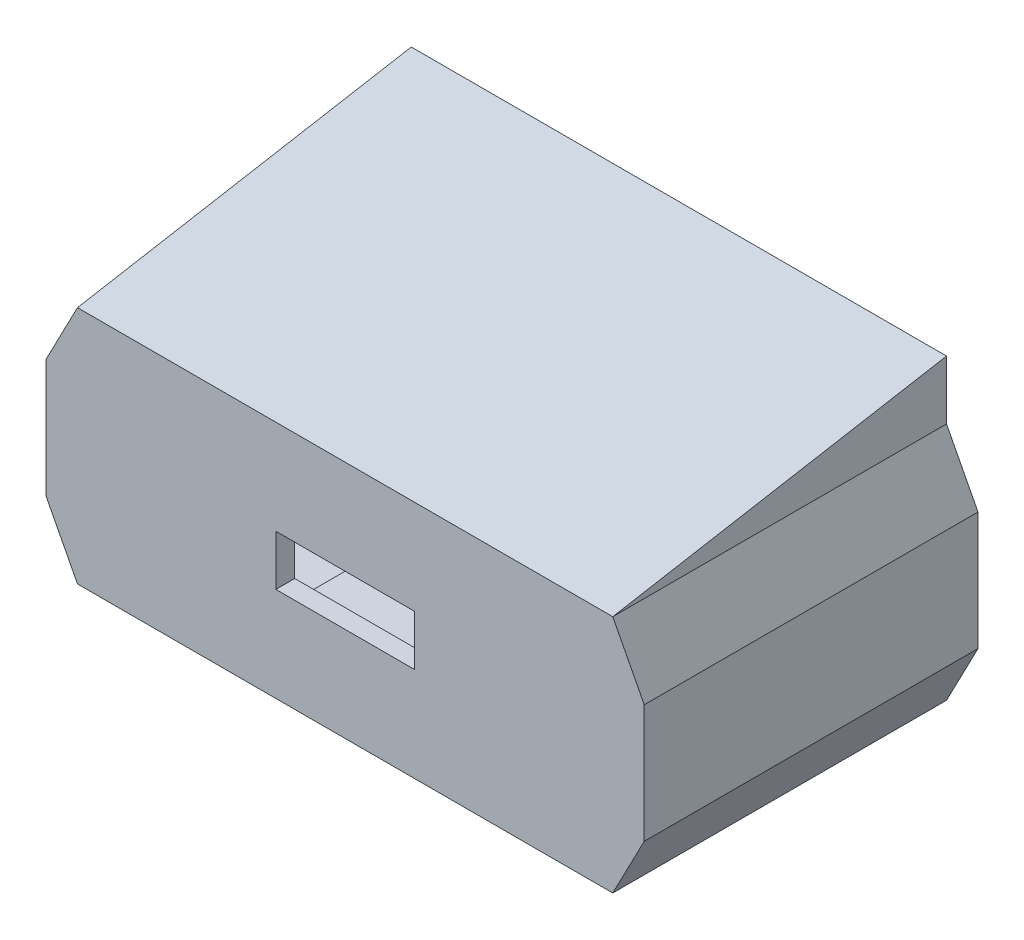
ISO-10303-21;
HEADER;
FILE_DESCRIPTION(('STEP AP214'),'2;1');
FILE_NAME('part.step','',(''),(''),'','','');
FILE_SCHEMA(('AUTOMOTIVE_DESIGN { 1 0 10303 214 1 1 1 1 }'));
ENDSEC;
DATA;
#1=APPLICATION_CONTEXT('core data for automotive mechanical design processes');
#2=APPLICATION_PROTOCOL_DEFINITION('international standard','automotive_design',2000,#1);
#3=PRODUCT_CONTEXT('',#1,'mechanical');
#4=PRODUCT('Part','Part','',(#3));
#5=PRODUCT_RELATED_PRODUCT_CATEGORY('part','',(#4));
#6=PRODUCT_DEFINITION_FORMATION('','',#4);
#7=PRODUCT_DEFINITION_CONTEXT('part definition',#1,'design');
#8=PRODUCT_DEFINITION('design','',#6,#7);
#9=PRODUCT_DEFINITION_SHAPE('','',#8);
#10=(LENGTH_UNIT() NAMED_UNIT(*) SI_UNIT(.MILLI.,.METRE.));
#11=(NAMED_UNIT(*) PLANE_ANGLE_UNIT() SI_UNIT($,.RADIAN.));
#12=(NAMED_UNIT(*) SI_UNIT($,.STERADIAN.) SOLID_ANGLE_UNIT());
#13=UNCERTAINTY_MEASURE_WITH_UNIT(LENGTH_MEASURE(1.E-05),#10,'distance_accuracy_value','');
#14=(GEOMETRIC_REPRESENTATION_CONTEXT(3) GLOBAL_UNCERTAINTY_ASSIGNED_CONTEXT((#13)) GLOBAL_UNIT_ASSIGNED_CONTEXT((#10,
#11,#12)) REPRESENTATION_CONTEXT('',''));
#15=CARTESIAN_POINT('',(0.,0.,0.));
#16=DIRECTION('',(0.,0.,1.));
#17=DIRECTION('',(1.,0.,0.));
#18=AXIS2_PLACEMENT_3D('',#15,#16,#17);
#19=CARTESIAN_POINT('',(0.,3.,0.));
#20=DIRECTION('',(0.,-1.,0.));
#21=DIRECTION('',(0.,0.,-1.));
#22=AXIS2_PLACEMENT_3D('',#19,#20,#21);
#23=PLANE('',#22);
#24=DIRECTION('',(0.,0.,1.));
#25=VECTOR('',#24,1.);
#26=CARTESIAN_POINT('',(50.,3.,-53.));
#27=LINE('',#26,#25);
#28=CARTESIAN_POINT('',(50.,3.,-53.));
#29=VERTEX_POINT('',#28);
#30=CARTESIAN_POINT('',(50.,3.,-47.5));
#31=VERTEX_POINT('',#30);
#32=EDGE_CURVE('E50',#29,#31,#27,.T.);
#33=ORIENTED_EDGE('',*,*,#32,.T.);
#34=DIRECTION('',(-1.,0.,0.));
#35=VECTOR('',#34,1.);
#36=CARTESIAN_POINT('',(50.,3.,-47.5));
#37=LINE('',#36,#35);
#38=CARTESIAN_POINT('',(43.,3.,-47.5));
#39=VERTEX_POINT('',#38);
#40=EDGE_CURVE('E54',#31,#39,#37,.T.);
#41=ORIENTED_EDGE('',*,*,#40,.T.);
#42=DIRECTION('',(0.,0.,1.));
#43=VECTOR('',#42,1.);
#44=CARTESIAN_POINT('',(43.,3.,-53.));
#45=LINE('',#44,#43);
#46=CARTESIAN_POINT('',(43.,3.,-53.));
#47=VERTEX_POINT('',#46);
#48=EDGE_CURVE('E596',#47,#39,#45,.T.);
#49=ORIENTED_EDGE('',*,*,#48,.F.);
#50=DIRECTION('',(-1.,0.,0.));
#51=VECTOR('',#50,1.);
#52=CARTESIAN_POINT('',(0.,3.,-53.));
#53=LINE('',#52,#51);
#54=CARTESIAN_POINT('',(0.,3.,-53.));
#55=VERTEX_POINT('',#54);
#56=EDGE_CURVE('E376',#47,#55,#53,.T.);
#57=ORIENTED_EDGE('',*,*,#56,.T.);
#58=DIRECTION('',(0.,0.,1.));
#59=VECTOR('',#58,1.);
#60=CARTESIAN_POINT('',(0.,3.,0.));
#61=LINE('',#60,#59);
#62=CARTESIAN_POINT('',(0.,3.,-3.));
#63=VERTEX_POINT('',#62);
#64=EDGE_CURVE('E469',#55,#63,#61,.T.);
#65=ORIENTED_EDGE('',*,*,#64,.T.);
#66=DIRECTION('',(1.,0.,0.));
#67=VECTOR('',#66,1.);
#68=CARTESIAN_POINT('',(0.,3.,-3.));
#69=LINE('',#68,#67);
#70=CARTESIAN_POINT('',(85.,3.,-3.));
#71=VERTEX_POINT('',#70);
#72=EDGE_CURVE('E416',#63,#71,#69,.T.);
#73=ORIENTED_EDGE('',*,*,#72,.T.);
#74=DIRECTION('',(0.,0.,-1.));
#75=VECTOR('',#74,1.);
#76=CARTESIAN_POINT('',(85.,3.,0.));
#77=LINE('',#76,#75);
#78=CARTESIAN_POINT('',(85.,3.,-53.));
#79=VERTEX_POINT('',#78);
#80=EDGE_CURVE('E471',#71,#79,#77,.T.);
#81=ORIENTED_EDGE('',*,*,#80,.T.);
#82=EDGE_CURVE('E377',#79,#29,#53,.T.);
#83=ORIENTED_EDGE('',*,*,#82,.T.);
#84=EDGE_LOOP('',(#33,#41,#49,#57,#65,#73,#81,#83));
#85=FACE_BOUND('',#84,.T.);
#86=ADVANCED_FACE('F35',(#85),#23,.F.);
#87=CARTESIAN_POINT('',(61.5,10.,-53.));
#88=DIRECTION('',(0.,1.,0.));
#89=DIRECTION('',(-1.,0.,0.));
#90=AXIS2_PLACEMENT_3D('',#87,#88,#89);
#91=PLANE('',#90);
#92=DIRECTION('',(0.,0.,-1.));
#93=VECTOR('',#92,1.);
#94=CARTESIAN_POINT('',(50.,10.,-47.5));
#95=LINE('',#94,#93);
#96=CARTESIAN_POINT('',(50.,10.,-47.5));
#97=VERTEX_POINT('',#96);
#98=CARTESIAN_POINT('',(50.,10.,-53.));
#99=VERTEX_POINT('',#98);
#100=EDGE_CURVE('E270',#97,#99,#95,.T.);
#101=ORIENTED_EDGE('',*,*,#100,.T.);
#102=DIRECTION('',(-1.,0.,0.));
#103=VECTOR('',#102,1.);
#104=CARTESIAN_POINT('',(61.5,10.,-53.));
#105=LINE('',#104,#103);
#106=CARTESIAN_POINT('',(61.5,10.,-53.));
#107=VERTEX_POINT('',#106);
#108=EDGE_CURVE('E280',#107,#99,#105,.T.);
#109=ORIENTED_EDGE('',*,*,#108,.F.);
#110=DIRECTION('',(0.,0.,1.));
#111=VECTOR('',#110,1.);
#112=CARTESIAN_POINT('',(61.5,10.,-53.));
#113=LINE('',#112,#111);
#114=CARTESIAN_POINT('',(61.5,10.,-3.));
#115=VERTEX_POINT('',#114);
#116=EDGE_CURVE('E321',#107,#115,#113,.T.);
#117=ORIENTED_EDGE('',*,*,#116,.T.);
#118=DIRECTION('',(-1.,0.,0.));
#119=VECTOR('',#118,1.);
#120=CARTESIAN_POINT('',(61.5,10.,-3.));
#121=LINE('',#120,#119);
#122=CARTESIAN_POINT('',(31.5,10.,-3.));
#123=VERTEX_POINT('',#122);
#124=EDGE_CURVE('E303',#115,#123,#121,.T.);
#125=ORIENTED_EDGE('',*,*,#124,.T.);
#126=DIRECTION('',(0.,0.,1.));
#127=VECTOR('',#126,1.);
#128=CARTESIAN_POINT('',(31.5,10.,-53.));
#129=LINE('',#128,#127);
#130=CARTESIAN_POINT('',(31.5,10.,-53.));
#131=VERTEX_POINT('',#130);
#132=EDGE_CURVE('E318',#131,#123,#129,.T.);
#133=ORIENTED_EDGE('',*,*,#132,.F.);
#134=CARTESIAN_POINT('',(43.,10.,-53.));
#135=VERTEX_POINT('',#134);
#136=EDGE_CURVE('E291',#135,#131,#105,.T.);
#137=ORIENTED_EDGE('',*,*,#136,.F.);
#138=DIRECTION('',(0.,0.,-1.));
#139=VECTOR('',#138,1.);
#140=CARTESIAN_POINT('',(43.,10.,-47.5));
#141=LINE('',#140,#139);
#142=CARTESIAN_POINT('',(43.,10.,-47.5));
#143=VERTEX_POINT('',#142);
#144=EDGE_CURVE('E603',#143,#135,#141,.T.);
#145=ORIENTED_EDGE('',*,*,#144,.F.);
#146=DIRECTION('',(-1.,0.,0.));
#147=VECTOR('',#146,1.);
#148=CARTESIAN_POINT('',(50.,10.,-47.5));
#149=LINE('',#148,#147);
#150=EDGE_CURVE('E283',#97,#143,#149,.T.);
#151=ORIENTED_EDGE('',*,*,#150,.F.);
#152=EDGE_LOOP('',(#101,#109,#117,#125,#133,#137,#145,#151));
#153=FACE_BOUND('',#152,.T.);
#154=ADVANCED_FACE('F278',(#153),#91,.F.);
#155=CARTESIAN_POINT('',(0.,23.,-93.));
#156=DIRECTION('',(0.,-1.,0.));
#157=DIRECTION('',(0.,0.,-1.));
#158=AXIS2_PLACEMENT_3D('',#155,#156,#157);
#159=PLANE('',#158);
#160=DIRECTION('',(0.,0.,1.));
#161=VECTOR('',#160,1.);
#162=CARTESIAN_POINT('',(-3.1,23.,-93.));
#163=LINE('',#162,#161);
#164=CARTESIAN_POINT('',(-3.1,23.,-53.));
#165=VERTEX_POINT('',#164);
#166=CARTESIAN_POINT('',(-3.1,23.,-3.));
#167=VERTEX_POINT('',#166);
#168=EDGE_CURVE('E422',#165,#167,#163,.T.);
#169=ORIENTED_EDGE('',*,*,#168,.T.);
#170=DIRECTION('',(1.,0.,0.));
#171=VECTOR('',#170,1.);
#172=CARTESIAN_POINT('',(0.,23.,-3.));
#173=LINE('',#172,#171);
#174=CARTESIAN_POINT('',(0.,23.,-3.));
#175=VERTEX_POINT('',#174);
#176=EDGE_CURVE('E533',#167,#175,#173,.T.);
#177=ORIENTED_EDGE('',*,*,#176,.T.);
#178=DIRECTION('',(0.,0.,1.));
#179=VECTOR('',#178,1.);
#180=CARTESIAN_POINT('',(0.,23.,-93.));
#181=LINE('',#180,#179);
#182=CARTESIAN_POINT('',(0.,23.,-53.));
#183=VERTEX_POINT('',#182);
#184=EDGE_CURVE('E429',#183,#175,#181,.T.);
#185=ORIENTED_EDGE('',*,*,#184,.F.);
#186=DIRECTION('',(-1.,0.,0.));
#187=VECTOR('',#186,1.);
#188=CARTESIAN_POINT('',(0.,23.,-53.));
#189=LINE('',#188,#187);
#190=EDGE_CURVE('E364',#183,#165,#189,.T.);
#191=ORIENTED_EDGE('',*,*,#190,.T.);
#192=EDGE_LOOP('',(#169,#177,#185,#191));
#193=FACE_BOUND('',#192,.T.);
#194=ADVANCED_FACE('F586',(#193),#159,.F.);
#195=CARTESIAN_POINT('',(85.,38.,-3.00000000000004));
#196=DIRECTION('',(0.,0.,1.));
#197=DIRECTION('',(1.,0.,0.));
#198=AXIS2_PLACEMENT_3D('',#195,#196,#197);
#199=PLANE('',#198);
#200=DIRECTION('',(0.,-1.,0.));
#201=VECTOR('',#200,1.);
#202=CARTESIAN_POINT('',(0.,23.,-3.));
#203=LINE('',#202,#201);
#204=EDGE_CURVE('E411',#175,#63,#203,.T.);
#205=ORIENTED_EDGE('',*,*,#204,.F.);
#206=ORIENTED_EDGE('',*,*,#176,.F.);
#207=DIRECTION('',(-0.707106781186548,-0.707106781186547,0.));
#208=VECTOR('',#207,1.);
#209=CARTESIAN_POINT('',(-3.1,23.,-3.));
#210=LINE('',#209,#208);
#211=CARTESIAN_POINT('',(0.,26.1,-3.));
#212=VERTEX_POINT('',#211);
#213=EDGE_CURVE('E529',#212,#167,#210,.T.);
#214=ORIENTED_EDGE('',*,*,#213,.F.);
#215=DIRECTION('',(0.,1.,0.));
#216=VECTOR('',#215,1.);
#217=CARTESIAN_POINT('',(0.,38.,-3.));
#218=LINE('',#217,#216);
#219=CARTESIAN_POINT('',(0.,28.,-3.00000000000003));
#220=VERTEX_POINT('',#219);
#221=EDGE_CURVE('E518',#212,#220,#218,.T.);
#222=ORIENTED_EDGE('',*,*,#221,.T.);
#223=DIRECTION('',(-0.707106781186549,-0.707106781186546,0.));
#224=VECTOR('',#223,1.);
#225=CARTESIAN_POINT('',(47.5000000000002,75.5,-3.00000000000004));
#226=LINE('',#225,#224);
#227=CARTESIAN_POINT('',(3.,31.,-3.00000000000006));
#228=VERTEX_POINT('',#227);
#229=EDGE_CURVE('E485',#220,#228,#226,.F.);
#230=ORIENTED_EDGE('',*,*,#229,.T.);
#231=DIRECTION('',(0.,-1.,0.));
#232=VECTOR('',#231,1.);
#233=CARTESIAN_POINT('',(3.,38.,-3.00000000000006));
#234=LINE('',#233,#232);
#235=CARTESIAN_POINT('',(3.,35.482701106467,-3.00000000000006));
#236=VERTEX_POINT('',#235);
#237=EDGE_CURVE('E406',#236,#228,#234,.T.);
#238=ORIENTED_EDGE('',*,*,#237,.F.);
#239=DIRECTION('',(1.,0.,0.));
#240=VECTOR('',#239,1.);
#241=CARTESIAN_POINT('',(85.,35.482701106467,-3.00000000000004));
#242=LINE('',#241,#240);
#243=CARTESIAN_POINT('',(82.,35.482701106467,-3.00000000000008));
#244=VERTEX_POINT('',#243);
#245=EDGE_CURVE('E399',#236,#244,#242,.T.);
#246=ORIENTED_EDGE('',*,*,#245,.T.);
#247=DIRECTION('',(0.,-1.,0.));
#248=VECTOR('',#247,1.);
#249=CARTESIAN_POINT('',(82.,38.,-3.00000000000008));
#250=LINE('',#249,#248);
#251=CARTESIAN_POINT('',(82.,31.,-3.00000000000008));
#252=VERTEX_POINT('',#251);
#253=EDGE_CURVE('E403',#244,#252,#250,.T.);
#254=ORIENTED_EDGE('',*,*,#253,.T.);
#255=DIRECTION('',(-0.707106781186549,0.707106781186546,0.));
#256=VECTOR('',#255,1.);
#257=CARTESIAN_POINT('',(80.,33.,-3.00000000000004));
#258=LINE('',#257,#256);
#259=CARTESIAN_POINT('',(85.,28.,-3.00000000000004));
#260=VERTEX_POINT('',#259);
#261=EDGE_CURVE('E488',#252,#260,#258,.F.);
#262=ORIENTED_EDGE('',*,*,#261,.T.);
#263=DIRECTION('',(0.,-1.,0.));
#264=VECTOR('',#263,1.);
#265=CARTESIAN_POINT('',(85.,38.,-3.));
#266=LINE('',#265,#264);
#267=CARTESIAN_POINT('',(85.,26.1,-3.));
#268=VERTEX_POINT('',#267);
#269=EDGE_CURVE('E522',#260,#268,#266,.T.);
#270=ORIENTED_EDGE('',*,*,#269,.T.);
#271=DIRECTION('',(-0.707106781186547,0.707106781186548,0.));
#272=VECTOR('',#271,1.);
#273=CARTESIAN_POINT('',(88.1,23.,-3.));
#274=LINE('',#273,#272);
#275=CARTESIAN_POINT('',(88.1,23.,-3.));
#276=VERTEX_POINT('',#275);
#277=EDGE_CURVE('E531',#276,#268,#274,.T.);
#278=ORIENTED_EDGE('',*,*,#277,.F.);
#279=DIRECTION('',(1.,0.,0.));
#280=VECTOR('',#279,1.);
#281=CARTESIAN_POINT('',(0.,23.,-3.));
#282=LINE('',#281,#280);
#283=CARTESIAN_POINT('',(85.,23.,-3.));
#284=VERTEX_POINT('',#283);
#285=EDGE_CURVE('E304',#284,#276,#282,.T.);
#286=ORIENTED_EDGE('',*,*,#285,.F.);
#287=DIRECTION('',(0.,1.,0.));
#288=VECTOR('',#287,1.);
#289=CARTESIAN_POINT('',(85.,23.,-3.));
#290=LINE('',#289,#288);
#291=EDGE_CURVE('E418',#71,#284,#290,.T.);
#292=ORIENTED_EDGE('',*,*,#291,.F.);
#293=ORIENTED_EDGE('',*,*,#72,.F.);
#294=EDGE_LOOP('',(#205,#206,#214,#222,#230,#238,#246,#254,#262,#270,#278,#286,#292,#293));
#295=FACE_BOUND('',#294,.T.);
#296=DIRECTION('',(1.,0.,0.));
#297=VECTOR('',#296,1.);
#298=CARTESIAN_POINT('',(0.,23.,-3.));
#299=LINE('',#298,#297);
#300=CARTESIAN_POINT('',(31.5,23.,-3.));
#301=VERTEX_POINT('',#300);
#302=CARTESIAN_POINT('',(53.5,23.,-3.));
#303=VERTEX_POINT('',#302);
#304=EDGE_CURVE('E511',#301,#303,#299,.T.);
#305=ORIENTED_EDGE('',*,*,#304,.F.);
#306=DIRECTION('',(0.,-1.,0.));
#307=VECTOR('',#306,1.);
#308=CARTESIAN_POINT('',(31.5,0.,-3.));
#309=LINE('',#308,#307);
#310=CARTESIAN_POINT('',(31.5,15.,-3.));
#311=VERTEX_POINT('',#310);
#312=EDGE_CURVE('E11',#301,#311,#309,.T.);
#313=ORIENTED_EDGE('',*,*,#312,.T.);
#314=DIRECTION('',(1.,0.,0.));
#315=VECTOR('',#314,1.);
#316=CARTESIAN_POINT('',(0.,15.,-3.));
#317=LINE('',#316,#315);
#318=CARTESIAN_POINT('',(53.5,15.,-3.));
#319=VERTEX_POINT('',#318);
#320=EDGE_CURVE('E502',#311,#319,#317,.T.);
#321=ORIENTED_EDGE('',*,*,#320,.T.);
#322=DIRECTION('',(0.,1.,0.));
#323=VECTOR('',#322,1.);
#324=CARTESIAN_POINT('',(53.5,0.,-3.));
#325=LINE('',#324,#323);
#326=EDGE_CURVE('E43',#319,#303,#325,.T.);
#327=ORIENTED_EDGE('',*,*,#326,.T.);
#328=EDGE_LOOP('',(#305,#313,#321,#327));
#329=FACE_BOUND('',#328,.T.);
#330=DIRECTION('',(0.,-1.,0.));
#331=VECTOR('',#330,1.);
#332=CARTESIAN_POINT('',(61.5,12.,-3.));
#333=LINE('',#332,#331);
#334=CARTESIAN_POINT('',(61.5,12.,-3.));
#335=VERTEX_POINT('',#334);
#336=EDGE_CURVE('E300',#335,#115,#333,.T.);
#337=ORIENTED_EDGE('',*,*,#336,.F.);
#338=DIRECTION('',(1.,0.,0.));
#339=VECTOR('',#338,1.);
#340=CARTESIAN_POINT('',(61.5,12.,-3.));
#341=LINE('',#340,#339);
#342=CARTESIAN_POINT('',(31.5,12.,-3.));
#343=VERTEX_POINT('',#342);
#344=EDGE_CURVE('E310',#343,#335,#341,.T.);
#345=ORIENTED_EDGE('',*,*,#344,.F.);
#346=DIRECTION('',(0.,1.,0.));
#347=VECTOR('',#346,1.);
#348=CARTESIAN_POINT('',(31.5,12.,-3.));
#349=LINE('',#348,#347);
#350=EDGE_CURVE('E307',#123,#343,#349,.T.);
#351=ORIENTED_EDGE('',*,*,#350,.F.);
#352=ORIENTED_EDGE('',*,*,#124,.F.);
#353=EDGE_LOOP('',(#337,#345,#351,#352));
#354=FACE_BOUND('',#353,.T.);
#355=ADVANCED_FACE('F509',(#295,#329,#354),#199,.F.);
#356=CARTESIAN_POINT('',(85.,38.,-93.));
#357=DIRECTION('',(-1.,0.,0.));
#358=DIRECTION('',(0.,0.,1.));
#359=AXIS2_PLACEMENT_3D('',#356,#357,#358);
#360=PLANE('',#359);
#361=ORIENTED_EDGE('',*,*,#269,.F.);
#362=DIRECTION('',(0.,0.,1.));
#363=VECTOR('',#362,1.);
#364=CARTESIAN_POINT('',(85.,28.,-10.));
#365=LINE('',#364,#363);
#366=CARTESIAN_POINT('',(85.,28.,-53.));
#367=VERTEX_POINT('',#366);
#368=EDGE_CURVE('E408',#367,#260,#365,.T.);
#369=ORIENTED_EDGE('',*,*,#368,.F.);
#370=DIRECTION('',(0.,1.,0.));
#371=VECTOR('',#370,1.);
#372=CARTESIAN_POINT('',(85.,38.,-53.));
#373=LINE('',#372,#371);
#374=CARTESIAN_POINT('',(85.,26.1,-53.));
#375=VERTEX_POINT('',#374);
#376=EDGE_CURVE('E359',#375,#367,#373,.T.);
#377=ORIENTED_EDGE('',*,*,#376,.F.);
#378=DIRECTION('',(0.,0.,1.));
#379=VECTOR('',#378,1.);
#380=CARTESIAN_POINT('',(85.,26.1,-93.));
#381=LINE('',#380,#379);
#382=EDGE_CURVE('E432',#375,#268,#381,.T.);
#383=ORIENTED_EDGE('',*,*,#382,.T.);
#384=EDGE_LOOP('',(#361,#369,#377,#383));
#385=FACE_BOUND('',#384,.T.);
#386=ADVANCED_FACE('F550',(#385),#360,.T.);
#387=CARTESIAN_POINT('',(0.,38.,-93.));
#388=DIRECTION('',(1.,0.,0.));
#389=DIRECTION('',(0.,1.,0.));
#390=AXIS2_PLACEMENT_3D('',#387,#388,#389);
#391=PLANE('',#390);
#392=ORIENTED_EDGE('',*,*,#221,.F.);
#393=DIRECTION('',(0.,0.,1.));
#394=VECTOR('',#393,1.);
#395=CARTESIAN_POINT('',(0.,26.1,-93.));
#396=LINE('',#395,#394);
#397=CARTESIAN_POINT('',(0.,26.1,-53.));
#398=VERTEX_POINT('',#397);
#399=EDGE_CURVE('E426',#398,#212,#396,.T.);
#400=ORIENTED_EDGE('',*,*,#399,.F.);
#401=DIRECTION('',(0.,-1.,0.));
#402=VECTOR('',#401,1.);
#403=CARTESIAN_POINT('',(0.,38.,-53.));
#404=LINE('',#403,#402);
#405=CARTESIAN_POINT('',(0.,28.,-53.));
#406=VERTEX_POINT('',#405);
#407=EDGE_CURVE('E357',#406,#398,#404,.T.);
#408=ORIENTED_EDGE('',*,*,#407,.F.);
#409=DIRECTION('',(0.,0.,1.));
#410=VECTOR('',#409,1.);
#411=CARTESIAN_POINT('',(0.,28.,-10.));
#412=LINE('',#411,#410);
#413=EDGE_CURVE('E409',#406,#220,#412,.T.);
#414=ORIENTED_EDGE('',*,*,#413,.T.);
#415=EDGE_LOOP('',(#392,#400,#408,#414));
#416=FACE_BOUND('',#415,.T.);
#417=ADVANCED_FACE('F577',(#416),#391,.T.);
#418=DIRECTION('',(0.,-1.,0.));
#419=VECTOR('',#418,1.);
#420=CARTESIAN_POINT('',(0.,38.,-53.));
#421=LINE('',#420,#419);
#422=EDGE_CURVE('E371',#183,#55,#421,.T.);
#423=ORIENTED_EDGE('',*,*,#422,.F.);
#424=ORIENTED_EDGE('',*,*,#184,.T.);
#425=ORIENTED_EDGE('',*,*,#204,.T.);
#426=ORIENTED_EDGE('',*,*,#64,.F.);
#427=EDGE_LOOP('',(#423,#424,#425,#426));
#428=FACE_BOUND('',#427,.T.);
#429=ADVANCED_FACE('F589',(#428),#391,.T.);
#430=DIRECTION('',(0.,1.,0.));
#431=VECTOR('',#430,1.);
#432=CARTESIAN_POINT('',(85.,38.,-53.));
#433=LINE('',#432,#431);
#434=CARTESIAN_POINT('',(85.,23.,-53.));
#435=VERTEX_POINT('',#434);
#436=EDGE_CURVE('E374',#79,#435,#433,.T.);
#437=ORIENTED_EDGE('',*,*,#436,.F.);
#438=ORIENTED_EDGE('',*,*,#80,.F.);
#439=ORIENTED_EDGE('',*,*,#291,.T.);
#440=DIRECTION('',(0.,0.,1.));
#441=VECTOR('',#440,1.);
#442=CARTESIAN_POINT('',(85.,23.,-93.));
#443=LINE('',#442,#441);
#444=EDGE_CURVE('E421',#435,#284,#443,.T.);
#445=ORIENTED_EDGE('',*,*,#444,.F.);
#446=EDGE_LOOP('',(#437,#438,#439,#445));
#447=FACE_BOUND('',#446,.T.);
#448=ADVANCED_FACE('F649',(#447),#360,.T.);
#449=CARTESIAN_POINT('',(0.,3.,0.));
#450=DIRECTION('',(0.,0.,-1.));
#451=DIRECTION('',(-1.,0.,0.));
#452=AXIS2_PLACEMENT_3D('',#449,#450,#451);
#453=PLANE('',#452);
#454=DIRECTION('',(-1.,0.,0.));
#455=VECTOR('',#454,1.);
#456=CARTESIAN_POINT('',(31.5,23.,0.));
#457=LINE('',#456,#455);
#458=CARTESIAN_POINT('',(53.5,23.,0.));
#459=VERTEX_POINT('',#458);
#460=CARTESIAN_POINT('',(31.5,23.,0.));
#461=VERTEX_POINT('',#460);
#462=EDGE_CURVE('E519',#459,#461,#457,.T.);
#463=ORIENTED_EDGE('',*,*,#462,.F.);
#464=DIRECTION('',(0.,1.,0.));
#465=VECTOR('',#464,1.);
#466=CARTESIAN_POINT('',(53.5,23.,0.));
#467=LINE('',#466,#465);
#468=CARTESIAN_POINT('',(53.5,15.,0.));
#469=VERTEX_POINT('',#468);
#470=EDGE_CURVE('E329',#469,#459,#467,.T.);
#471=ORIENTED_EDGE('',*,*,#470,.F.);
#472=DIRECTION('',(1.,0.,0.));
#473=VECTOR('',#472,1.);
#474=CARTESIAN_POINT('',(31.5,15.,0.));
#475=LINE('',#474,#473);
#476=CARTESIAN_POINT('',(31.5,15.,0.));
#477=VERTEX_POINT('',#476);
#478=EDGE_CURVE('E326',#477,#469,#475,.T.);
#479=ORIENTED_EDGE('',*,*,#478,.F.);
#480=DIRECTION('',(0.,-1.,0.));
#481=VECTOR('',#480,1.);
#482=CARTESIAN_POINT('',(31.5,23.,0.));
#483=LINE('',#482,#481);
#484=EDGE_CURVE('E323',#461,#477,#483,.T.);
#485=ORIENTED_EDGE('',*,*,#484,.F.);
#486=EDGE_LOOP('',(#463,#471,#479,#485));
#487=FACE_BOUND('',#486,.T.);
#488=DIRECTION('',(-0.461591586339288,0.887092558542106,0.));
#489=VECTOR('',#488,1.);
#490=CARTESIAN_POINT('',(90.,28.3909366548759,0.));
#491=LINE('',#490,#489);
#492=CARTESIAN_POINT('',(90.,28.3909366548759,0.));
#493=VERTEX_POINT('',#492);
#494=CARTESIAN_POINT('',(85.,38.,0.));
#495=VERTEX_POINT('',#494);
#496=EDGE_CURVE('E444',#493,#495,#491,.T.);
#497=ORIENTED_EDGE('',*,*,#496,.T.);
#498=DIRECTION('',(-1.,0.,0.));
#499=VECTOR('',#498,1.);
#500=CARTESIAN_POINT('',(0.,37.9999999999988,0.));
#501=LINE('',#500,#499);
#502=CARTESIAN_POINT('',(0.,38.,0.));
#503=VERTEX_POINT('',#502);
#504=EDGE_CURVE('E494',#495,#503,#501,.T.);
#505=ORIENTED_EDGE('',*,*,#504,.T.);
#506=DIRECTION('',(-0.461591586339287,-0.887092558542106,0.));
#507=VECTOR('',#506,1.);
#508=CARTESIAN_POINT('',(-5.,28.3909366548759,0.));
#509=LINE('',#508,#507);
#510=CARTESIAN_POINT('',(-5.,28.3909366548759,0.));
#511=VERTEX_POINT('',#510);
#512=EDGE_CURVE('E456',#503,#511,#509,.T.);
#513=ORIENTED_EDGE('',*,*,#512,.T.);
#514=DIRECTION('',(0.,-1.,0.));
#515=VECTOR('',#514,1.);
#516=CARTESIAN_POINT('',(-5.,9.60906334512409,0.));
#517=LINE('',#516,#515);
#518=CARTESIAN_POINT('',(-5.,9.60906334512409,0.));
#519=VERTEX_POINT('',#518);
#520=EDGE_CURVE('E459',#511,#519,#517,.T.);
#521=ORIENTED_EDGE('',*,*,#520,.T.);
#522=DIRECTION('',(0.461591586339287,-0.887092558542106,0.));
#523=VECTOR('',#522,1.);
#524=CARTESIAN_POINT('',(0.,0.,0.));
#525=LINE('',#524,#523);
#526=CARTESIAN_POINT('',(0.,0.,0.));
#527=VERTEX_POINT('',#526);
#528=EDGE_CURVE('E450',#519,#527,#525,.T.);
#529=ORIENTED_EDGE('',*,*,#528,.T.);
#530=DIRECTION('',(1.,0.,0.));
#531=VECTOR('',#530,1.);
#532=CARTESIAN_POINT('',(0.,0.,0.));
#533=LINE('',#532,#531);
#534=CARTESIAN_POINT('',(85.,0.,0.));
#535=VERTEX_POINT('',#534);
#536=EDGE_CURVE('E477',#527,#535,#533,.T.);
#537=ORIENTED_EDGE('',*,*,#536,.T.);
#538=DIRECTION('',(0.461591586339288,0.887092558542106,0.));
#539=VECTOR('',#538,1.);
#540=CARTESIAN_POINT('',(85.,0.,0.));
#541=LINE('',#540,#539);
#542=CARTESIAN_POINT('',(90.,9.60906334512409,0.));
#543=VERTEX_POINT('',#542);
#544=EDGE_CURVE('E425',#535,#543,#541,.T.);
#545=ORIENTED_EDGE('',*,*,#544,.T.);
#546=DIRECTION('',(0.,1.,0.));
#547=VECTOR('',#546,1.);
#548=CARTESIAN_POINT('',(90.,9.60906334512409,0.));
#549=LINE('',#548,#547);
#550=EDGE_CURVE('E441',#543,#493,#549,.T.);
#551=ORIENTED_EDGE('',*,*,#550,.T.);
#552=EDGE_LOOP('',(#497,#505,#513,#521,#529,#537,#545,#551));
#553=FACE_BOUND('',#552,.T.);
#554=ADVANCED_FACE('F645',(#487,#553),#453,.F.);
#555=CARTESIAN_POINT('',(0.,0.,0.));
#556=DIRECTION('',(0.,-1.,0.));
#557=DIRECTION('',(0.,0.,-1.));
#558=AXIS2_PLACEMENT_3D('',#555,#556,#557);
#559=PLANE('',#558);
#560=DIRECTION('',(-1.,0.,0.));
#561=VECTOR('',#560,1.);
#562=CARTESIAN_POINT('',(-5.,0.,-53.));
#563=LINE('',#562,#561);
#564=CARTESIAN_POINT('',(85.,0.,-53.));
#565=VERTEX_POINT('',#564);
#566=CARTESIAN_POINT('',(0.,0.,-53.));
#567=VERTEX_POINT('',#566);
#568=EDGE_CURVE('E334',#565,#567,#563,.T.);
#569=ORIENTED_EDGE('',*,*,#568,.F.);
#570=DIRECTION('',(0.,0.,-1.));
#571=VECTOR('',#570,1.);
#572=CARTESIAN_POINT('',(85.,0.,0.));
#573=LINE('',#572,#571);
#574=EDGE_CURVE('E472',#535,#565,#573,.T.);
#575=ORIENTED_EDGE('',*,*,#574,.F.);
#576=ORIENTED_EDGE('',*,*,#536,.F.);
#577=DIRECTION('',(0.,0.,1.));
#578=VECTOR('',#577,1.);
#579=CARTESIAN_POINT('',(0.,0.,0.));
#580=LINE('',#579,#578);
#581=EDGE_CURVE('E465',#567,#527,#580,.T.);
#582=ORIENTED_EDGE('',*,*,#581,.F.);
#583=EDGE_LOOP('',(#569,#575,#576,#582));
#584=FACE_BOUND('',#583,.T.);
#585=ADVANCED_FACE('F642',(#584),#559,.T.);
#586=CARTESIAN_POINT('',(0.,0.,-93.));
#587=DIRECTION('',(-0.887092558542106,-0.461591586339287,0.));
#588=DIRECTION('',(0.461591586339287,-0.887092558542106,0.));
#589=AXIS2_PLACEMENT_3D('',#586,#587,#588);
#590=PLANE('',#589);
#591=ORIENTED_EDGE('',*,*,#581,.T.);
#592=ORIENTED_EDGE('',*,*,#528,.F.);
#593=DIRECTION('',(0.,0.,1.));
#594=VECTOR('',#593,1.);
#595=CARTESIAN_POINT('',(-5.,9.60906334512409,-93.));
#596=LINE('',#595,#594);
#597=CARTESIAN_POINT('',(-5.,9.6090633451241,-53.));
#598=VERTEX_POINT('',#597);
#599=EDGE_CURVE('E463',#598,#519,#596,.T.);
#600=ORIENTED_EDGE('',*,*,#599,.F.);
#601=DIRECTION('',(-0.461591586339287,0.887092558542106,0.));
#602=VECTOR('',#601,1.);
#603=CARTESIAN_POINT('',(0.,0.,-53.));
#604=LINE('',#603,#602);
#605=EDGE_CURVE('E394',#567,#598,#604,.T.);
#606=ORIENTED_EDGE('',*,*,#605,.F.);
#607=EDGE_LOOP('',(#591,#592,#600,#606));
#608=FACE_BOUND('',#607,.T.);
#609=ADVANCED_FACE('F640',(#608),#590,.T.);
#610=CARTESIAN_POINT('',(-5.,9.60906334512409,-93.));
#611=DIRECTION('',(-1.,0.,0.));
#612=DIRECTION('',(0.,-1.,0.));
#613=AXIS2_PLACEMENT_3D('',#610,#611,#612);
#614=PLANE('',#613);
#615=ORIENTED_EDGE('',*,*,#599,.T.);
#616=ORIENTED_EDGE('',*,*,#520,.F.);
#617=DIRECTION('',(0.,0.,1.));
#618=VECTOR('',#617,1.);
#619=CARTESIAN_POINT('',(-5.,28.3909366548759,-93.));
#620=LINE('',#619,#618);
#621=CARTESIAN_POINT('',(-4.99999999999999,28.3909366548759,-53.));
#622=VERTEX_POINT('',#621);
#623=EDGE_CURVE('E466',#622,#511,#620,.T.);
#624=ORIENTED_EDGE('',*,*,#623,.F.);
#625=DIRECTION('',(0.,-1.,0.));
#626=VECTOR('',#625,1.);
#627=CARTESIAN_POINT('',(-5.,54.3984092058858,-53.));
#628=LINE('',#627,#626);
#629=EDGE_CURVE('E343',#622,#598,#628,.T.);
#630=ORIENTED_EDGE('',*,*,#629,.T.);
#631=EDGE_LOOP('',(#615,#616,#624,#630));
#632=FACE_BOUND('',#631,.T.);
#633=ADVANCED_FACE('F695',(#632),#614,.T.);
#634=CARTESIAN_POINT('',(-5.,28.3909366548759,-93.));
#635=DIRECTION('',(-0.887092558542106,0.461591586339287,0.));
#636=DIRECTION('',(-0.461591586339287,-0.887092558542106,0.));
#637=AXIS2_PLACEMENT_3D('',#634,#635,#636);
#638=PLANE('',#637);
#639=ORIENTED_EDGE('',*,*,#623,.T.);
#640=ORIENTED_EDGE('',*,*,#512,.F.);
#641=DIRECTION('',(0.,0.,1.));
#642=VECTOR('',#641,1.);
#643=CARTESIAN_POINT('',(0.,38.,-93.));
#644=LINE('',#643,#642);
#645=CARTESIAN_POINT('',(0.,38.,-53.));
#646=VERTEX_POINT('',#645);
#647=EDGE_CURVE('E462',#646,#503,#644,.T.);
#648=ORIENTED_EDGE('',*,*,#647,.F.);
#649=DIRECTION('',(0.461591586339287,0.887092558542106,0.));
#650=VECTOR('',#649,1.);
#651=CARTESIAN_POINT('',(-5.,28.3909366548759,-53.));
#652=LINE('',#651,#650);
#653=EDGE_CURVE('E389',#622,#646,#652,.T.);
#654=ORIENTED_EDGE('',*,*,#653,.F.);
#655=EDGE_LOOP('',(#639,#640,#648,#654));
#656=FACE_BOUND('',#655,.T.);
#657=ADVANCED_FACE('F693',(#656),#638,.T.);
#658=CARTESIAN_POINT('',(85.,0.,-93.));
#659=DIRECTION('',(0.887092558542106,-0.461591586339288,0.));
#660=DIRECTION('',(0.461591586339288,0.887092558542106,0.));
#661=AXIS2_PLACEMENT_3D('',#658,#659,#660);
#662=PLANE('',#661);
#663=DIRECTION('',(0.,0.,1.));
#664=VECTOR('',#663,1.);
#665=CARTESIAN_POINT('',(90.,9.60906334512409,-93.));
#666=LINE('',#665,#664);
#667=CARTESIAN_POINT('',(90.,9.6090633451241,-53.));
#668=VERTEX_POINT('',#667);
#669=EDGE_CURVE('E447',#668,#543,#666,.T.);
#670=ORIENTED_EDGE('',*,*,#669,.T.);
#671=ORIENTED_EDGE('',*,*,#544,.F.);
#672=ORIENTED_EDGE('',*,*,#574,.T.);
#673=DIRECTION('',(-0.461591586339288,-0.887092558542106,0.));
#674=VECTOR('',#673,1.);
#675=CARTESIAN_POINT('',(85.,0.,-53.));
#676=LINE('',#675,#674);
#677=EDGE_CURVE('E391',#668,#565,#676,.T.);
#678=ORIENTED_EDGE('',*,*,#677,.F.);
#679=EDGE_LOOP('',(#670,#671,#672,#678));
#680=FACE_BOUND('',#679,.T.);
#681=ADVANCED_FACE('F686',(#680),#662,.T.);
#682=CARTESIAN_POINT('',(90.,28.3909366548759,-93.));
#683=DIRECTION('',(0.887092558542106,0.461591586339288,0.));
#684=DIRECTION('',(-0.461591586339288,0.887092558542106,0.));
#685=AXIS2_PLACEMENT_3D('',#682,#683,#684);
#686=PLANE('',#685);
#687=DIRECTION('',(0.,0.,1.));
#688=VECTOR('',#687,1.);
#689=CARTESIAN_POINT('',(85.,38.,-93.));
#690=LINE('',#689,#688);
#691=CARTESIAN_POINT('',(85.,38.,-53.));
#692=VERTEX_POINT('',#691);
#693=EDGE_CURVE('E448',#692,#495,#690,.T.);
#694=ORIENTED_EDGE('',*,*,#693,.T.);
#695=ORIENTED_EDGE('',*,*,#496,.F.);
#696=DIRECTION('',(0.,0.,1.));
#697=VECTOR('',#696,1.);
#698=CARTESIAN_POINT('',(90.,28.3909366548759,-93.));
#699=LINE('',#698,#697);
#700=CARTESIAN_POINT('',(90.,28.3909366548759,-53.));
#701=VERTEX_POINT('',#700);
#702=EDGE_CURVE('E451',#701,#493,#699,.T.);
#703=ORIENTED_EDGE('',*,*,#702,.F.);
#704=DIRECTION('',(0.461591586339288,-0.887092558542106,0.));
#705=VECTOR('',#704,1.);
#706=CARTESIAN_POINT('',(90.,28.3909366548759,-53.));
#707=LINE('',#706,#705);
#708=EDGE_CURVE('E387',#692,#701,#707,.T.);
#709=ORIENTED_EDGE('',*,*,#708,.F.);
#710=EDGE_LOOP('',(#694,#695,#703,#709));
#711=FACE_BOUND('',#710,.T.);
#712=ADVANCED_FACE('F683',(#711),#686,.T.);
#713=CARTESIAN_POINT('',(90.,9.60906334512409,-93.));
#714=DIRECTION('',(1.,0.,0.));
#715=DIRECTION('',(0.,0.,-1.));
#716=AXIS2_PLACEMENT_3D('',#713,#714,#715);
#717=PLANE('',#716);
#718=ORIENTED_EDGE('',*,*,#702,.T.);
#719=ORIENTED_EDGE('',*,*,#550,.F.);
#720=ORIENTED_EDGE('',*,*,#669,.F.);
#721=DIRECTION('',(0.,-1.,0.));
#722=VECTOR('',#721,1.);
#723=CARTESIAN_POINT('',(90.,54.3984092058858,-53.));
#724=LINE('',#723,#722);
#725=EDGE_CURVE('E342',#701,#668,#724,.T.);
#726=ORIENTED_EDGE('',*,*,#725,.F.);
#727=EDGE_LOOP('',(#718,#719,#720,#726));
#728=FACE_BOUND('',#727,.T.);
#729=ADVANCED_FACE('F679',(#728),#717,.T.);
#730=CARTESIAN_POINT('',(88.1,23.,-93.));
#731=DIRECTION('',(0.707106781186548,0.707106781186547,0.));
#732=DIRECTION('',(-0.707106781186547,0.707106781186548,0.));
#733=AXIS2_PLACEMENT_3D('',#730,#731,#732);
#734=PLANE('',#733);
#735=DIRECTION('',(0.,0.,1.));
#736=VECTOR('',#735,1.);
#737=CARTESIAN_POINT('',(88.1,23.,-93.));
#738=LINE('',#737,#736);
#739=CARTESIAN_POINT('',(88.1,23.,-53.));
#740=VERTEX_POINT('',#739);
#741=EDGE_CURVE('E435',#740,#276,#738,.T.);
#742=ORIENTED_EDGE('',*,*,#741,.T.);
#743=ORIENTED_EDGE('',*,*,#277,.T.);
#744=ORIENTED_EDGE('',*,*,#382,.F.);
#745=DIRECTION('',(0.707106781186547,-0.707106781186548,0.));
#746=VECTOR('',#745,1.);
#747=CARTESIAN_POINT('',(88.1,23.,-53.));
#748=LINE('',#747,#746);
#749=EDGE_CURVE('E367',#375,#740,#748,.T.);
#750=ORIENTED_EDGE('',*,*,#749,.T.);
#751=EDGE_LOOP('',(#742,#743,#744,#750));
#752=FACE_BOUND('',#751,.T.);
#753=ADVANCED_FACE('F544',(#752),#734,.F.);
#754=ORIENTED_EDGE('',*,*,#444,.T.);
#755=ORIENTED_EDGE('',*,*,#285,.T.);
#756=ORIENTED_EDGE('',*,*,#741,.F.);
#757=EDGE_CURVE('E368',#740,#435,#189,.T.);
#758=ORIENTED_EDGE('',*,*,#757,.T.);
#759=EDGE_LOOP('',(#754,#755,#756,#758));
#760=FACE_BOUND('',#759,.T.);
#761=ADVANCED_FACE('F537',(#760),#159,.F.);
#762=CARTESIAN_POINT('',(-3.1,23.,-93.));
#763=DIRECTION('',(-0.707106781186547,0.707106781186548,0.));
#764=DIRECTION('',(-0.707106781186548,-0.707106781186547,0.));
#765=AXIS2_PLACEMENT_3D('',#762,#763,#764);
#766=PLANE('',#765);
#767=ORIENTED_EDGE('',*,*,#399,.T.);
#768=ORIENTED_EDGE('',*,*,#213,.T.);
#769=ORIENTED_EDGE('',*,*,#168,.F.);
#770=DIRECTION('',(0.707106781186548,0.707106781186547,0.));
#771=VECTOR('',#770,1.);
#772=CARTESIAN_POINT('',(-3.1,23.,-53.));
#773=LINE('',#772,#771);
#774=EDGE_CURVE('E361',#165,#398,#773,.T.);
#775=ORIENTED_EDGE('',*,*,#774,.T.);
#776=EDGE_LOOP('',(#767,#768,#769,#775));
#777=FACE_BOUND('',#776,.T.);
#778=ADVANCED_FACE('F580',(#777),#766,.F.);
#779=CARTESIAN_POINT('',(3.,38.,-3.00000000000006));
#780=DIRECTION('',(-1.,0.,0.));
#781=DIRECTION('',(0.,0.,1.));
#782=AXIS2_PLACEMENT_3D('',#779,#780,#781);
#783=PLANE('',#782);
#784=DIRECTION('',(0.,0.,-1.));
#785=VECTOR('',#784,1.);
#786=CARTESIAN_POINT('',(3.,31.,-3.00000000000006));
#787=LINE('',#786,#785);
#788=CARTESIAN_POINT('',(3.,31.,-53.));
#789=VERTEX_POINT('',#788);
#790=EDGE_CURVE('E475',#228,#789,#787,.T.);
#791=ORIENTED_EDGE('',*,*,#790,.T.);
#792=DIRECTION('',(0.,1.,0.));
#793=VECTOR('',#792,1.);
#794=CARTESIAN_POINT('',(3.,38.,-53.));
#795=LINE('',#794,#793);
#796=CARTESIAN_POINT('',(3.,44.2990501418901,-53.));
#797=VERTEX_POINT('',#796);
#798=EDGE_CURVE('E350',#789,#797,#795,.T.);
#799=ORIENTED_EDGE('',*,*,#798,.T.);
#800=DIRECTION('',(0.,-0.173648177666927,0.984807753012209));
#801=VECTOR('',#800,1.);
#802=CARTESIAN_POINT('',(3.,35.5586069559507,-3.43048346417991));
#803=LINE('',#802,#801);
#804=EDGE_CURVE('E401',#797,#236,#803,.T.);
#805=ORIENTED_EDGE('',*,*,#804,.T.);
#806=ORIENTED_EDGE('',*,*,#237,.T.);
#807=EDGE_LOOP('',(#791,#799,#805,#806));
#808=FACE_BOUND('',#807,.T.);
#809=ADVANCED_FACE('F567',(#808),#783,.F.);
#810=CARTESIAN_POINT('',(82.,38.,-3.00000000000008));
#811=DIRECTION('',(1.,0.,0.));
#812=DIRECTION('',(0.,0.,-1.));
#813=AXIS2_PLACEMENT_3D('',#810,#811,#812);
#814=PLANE('',#813);
#815=DIRECTION('',(0.,0.173648177666927,-0.984807753012209));
#816=VECTOR('',#815,1.);
#817=CARTESIAN_POINT('',(82.,35.5586069559507,-3.43048346417993));
#818=LINE('',#817,#816);
#819=CARTESIAN_POINT('',(82.,44.2990501418901,-53.));
#820=VERTEX_POINT('',#819);
#821=EDGE_CURVE('E396',#244,#820,#818,.T.);
#822=ORIENTED_EDGE('',*,*,#821,.T.);
#823=DIRECTION('',(0.,-1.,0.));
#824=VECTOR('',#823,1.);
#825=CARTESIAN_POINT('',(82.,38.,-53.));
#826=LINE('',#825,#824);
#827=CARTESIAN_POINT('',(82.,31.,-53.));
#828=VERTEX_POINT('',#827);
#829=EDGE_CURVE('E346',#820,#828,#826,.T.);
#830=ORIENTED_EDGE('',*,*,#829,.T.);
#831=DIRECTION('',(0.,0.,1.));
#832=VECTOR('',#831,1.);
#833=CARTESIAN_POINT('',(82.,31.,-3.00000000000008));
#834=LINE('',#833,#832);
#835=EDGE_CURVE('E483',#828,#252,#834,.T.);
#836=ORIENTED_EDGE('',*,*,#835,.T.);
#837=ORIENTED_EDGE('',*,*,#253,.F.);
#838=EDGE_LOOP('',(#822,#830,#836,#837));
#839=FACE_BOUND('',#838,.T.);
#840=ADVANCED_FACE('F558',(#839),#814,.F.);
#841=CARTESIAN_POINT('',(3.,31.,-3.00000000000006));
#842=DIRECTION('',(-0.707106781186546,0.707106781186549,0.));
#843=DIRECTION('',(0.,0.,-1.));
#844=AXIS2_PLACEMENT_3D('',#841,#842,#843);
#845=PLANE('',#844);
#846=DIRECTION('',(0.707106781186549,0.707106781186546,0.));
#847=VECTOR('',#846,1.);
#848=CARTESIAN_POINT('',(3.,31.,-53.));
#849=LINE('',#848,#847);
#850=EDGE_CURVE('E355',#789,#406,#849,.F.);
#851=ORIENTED_EDGE('',*,*,#850,.F.);
#852=ORIENTED_EDGE('',*,*,#790,.F.);
#853=ORIENTED_EDGE('',*,*,#229,.F.);
#854=ORIENTED_EDGE('',*,*,#413,.F.);
#855=EDGE_LOOP('',(#851,#852,#853,#854));
#856=FACE_BOUND('',#855,.T.);
#857=ADVANCED_FACE('F572',(#856),#845,.F.);
#858=CARTESIAN_POINT('',(82.,31.,-3.00000000000008));
#859=DIRECTION('',(0.707106781186546,0.707106781186549,0.));
#860=DIRECTION('',(0.,0.,1.));
#861=AXIS2_PLACEMENT_3D('',#858,#859,#860);
#862=PLANE('',#861);
#863=DIRECTION('',(0.707106781186549,-0.707106781186546,0.));
#864=VECTOR('',#863,1.);
#865=CARTESIAN_POINT('',(82.,31.,-53.));
#866=LINE('',#865,#864);
#867=EDGE_CURVE('E353',#367,#828,#866,.F.);
#868=ORIENTED_EDGE('',*,*,#867,.F.);
#869=ORIENTED_EDGE('',*,*,#368,.T.);
#870=ORIENTED_EDGE('',*,*,#261,.F.);
#871=ORIENTED_EDGE('',*,*,#835,.F.);
#872=EDGE_LOOP('',(#868,#869,#870,#871));
#873=FACE_BOUND('',#872,.T.);
#874=ADVANCED_FACE('F554',(#873),#862,.F.);
#875=CARTESIAN_POINT('',(0.,68.,0.));
#876=DIRECTION('',(1.,0.,0.));
#877=DIRECTION('',(0.,0.,-1.));
#878=AXIS2_PLACEMENT_3D('',#875,#876,#877);
#879=PLANE('',#878);
#880=DIRECTION('',(0.,-0.173648177666927,0.984807753012209));
#881=VECTOR('',#880,1.);
#882=CARTESIAN_POINT('',(0.,68.,-170.138454588541));
#883=LINE('',#882,#881);
#884=CARTESIAN_POINT('',(0.,47.3453299775473,-53.));
#885=VERTEX_POINT('',#884);
#886=EDGE_CURVE('E497',#503,#885,#883,.F.);
#887=ORIENTED_EDGE('',*,*,#886,.T.);
#888=DIRECTION('',(0.,-1.,0.));
#889=VECTOR('',#888,1.);
#890=CARTESIAN_POINT('',(0.,68.,-53.));
#891=LINE('',#890,#889);
#892=EDGE_CURVE('E384',#885,#646,#891,.T.);
#893=ORIENTED_EDGE('',*,*,#892,.T.);
#894=ORIENTED_EDGE('',*,*,#647,.T.);
#895=EDGE_LOOP('',(#887,#893,#894));
#896=FACE_BOUND('',#895,.T.);
#897=ADVANCED_FACE('F653',(#896),#879,.F.);
#898=CARTESIAN_POINT('',(85.,68.,-93.));
#899=DIRECTION('',(-1.,0.,0.));
#900=DIRECTION('',(0.,0.,1.));
#901=AXIS2_PLACEMENT_3D('',#898,#899,#900);
#902=PLANE('',#901);
#903=ORIENTED_EDGE('',*,*,#693,.F.);
#904=DIRECTION('',(0.,1.,0.));
#905=VECTOR('',#904,1.);
#906=CARTESIAN_POINT('',(85.,68.,-53.));
#907=LINE('',#906,#905);
#908=CARTESIAN_POINT('',(85.,47.3453299775473,-53.));
#909=VERTEX_POINT('',#908);
#910=EDGE_CURVE('E381',#692,#909,#907,.T.);
#911=ORIENTED_EDGE('',*,*,#910,.T.);
#912=DIRECTION('',(0.,0.173648177666927,-0.984807753012209));
#913=VECTOR('',#912,1.);
#914=CARTESIAN_POINT('',(85.,68.,-170.138454588541));
#915=LINE('',#914,#913);
#916=EDGE_CURVE('E491',#909,#495,#915,.F.);
#917=ORIENTED_EDGE('',*,*,#916,.T.);
#918=EDGE_LOOP('',(#903,#911,#917));
#919=FACE_BOUND('',#918,.T.);
#920=ADVANCED_FACE('F657',(#919),#902,.F.);
#921=CARTESIAN_POINT('',(0.,68.,-170.138454588541));
#922=DIRECTION('',(0.,-0.984807753012208,-0.173648177666927));
#923=DIRECTION('',(1.,0.,0.));
#924=AXIS2_PLACEMENT_3D('',#921,#922,#923);
#925=PLANE('',#924);
#926=DIRECTION('',(-1.,0.,0.));
#927=VECTOR('',#926,1.);
#928=CARTESIAN_POINT('',(0.,47.3453299775473,-53.));
#929=LINE('',#928,#927);
#930=EDGE_CURVE('E379',#885,#909,#929,.F.);
#931=ORIENTED_EDGE('',*,*,#930,.F.);
#932=ORIENTED_EDGE('',*,*,#886,.F.);
#933=ORIENTED_EDGE('',*,*,#504,.F.);
#934=ORIENTED_EDGE('',*,*,#916,.F.);
#935=EDGE_LOOP('',(#931,#932,#933,#934));
#936=FACE_BOUND('',#935,.T.);
#937=ADVANCED_FACE('F37',(#936),#925,.F.);
#938=CARTESIAN_POINT('',(0.,33.8997365358945,5.97743819018661));
#939=DIRECTION('',(0.,-0.984807753012209,-0.173648177666927));
#940=DIRECTION('',(0.,0.173648177666927,-0.984807753012209));
#941=AXIS2_PLACEMENT_3D('',#938,#939,#940);
#942=PLANE('',#941);
#943=DIRECTION('',(-1.,0.,0.));
#944=VECTOR('',#943,1.);
#945=CARTESIAN_POINT('',(0.,44.2990501418901,-53.));
#946=LINE('',#945,#944);
#947=EDGE_CURVE('E500',#820,#797,#946,.T.);
#948=ORIENTED_EDGE('',*,*,#947,.F.);
#949=ORIENTED_EDGE('',*,*,#821,.F.);
#950=ORIENTED_EDGE('',*,*,#245,.F.);
#951=ORIENTED_EDGE('',*,*,#804,.F.);
#952=EDGE_LOOP('',(#948,#949,#950,#951));
#953=FACE_BOUND('',#952,.T.);
#954=ADVANCED_FACE('F563',(#953),#942,.T.);
#955=CARTESIAN_POINT('',(-5.,54.3984092058858,-53.));
#956=DIRECTION('',(0.,0.,1.));
#957=DIRECTION('',(1.,0.,0.));
#958=AXIS2_PLACEMENT_3D('',#955,#956,#957);
#959=PLANE('',#958);
#960=ORIENTED_EDGE('',*,*,#605,.T.);
#961=ORIENTED_EDGE('',*,*,#629,.F.);
#962=ORIENTED_EDGE('',*,*,#653,.T.);
#963=ORIENTED_EDGE('',*,*,#892,.F.);
#964=ORIENTED_EDGE('',*,*,#930,.T.);
#965=ORIENTED_EDGE('',*,*,#910,.F.);
#966=ORIENTED_EDGE('',*,*,#708,.T.);
#967=ORIENTED_EDGE('',*,*,#725,.T.);
#968=ORIENTED_EDGE('',*,*,#677,.T.);
#969=ORIENTED_EDGE('',*,*,#568,.T.);
#970=EDGE_LOOP('',(#960,#961,#962,#963,#964,#965,#966,#967,#968,#969));
#971=FACE_BOUND('',#970,.T.);
#972=ORIENTED_EDGE('',*,*,#436,.T.);
#973=ORIENTED_EDGE('',*,*,#757,.F.);
#974=ORIENTED_EDGE('',*,*,#749,.F.);
#975=ORIENTED_EDGE('',*,*,#376,.T.);
#976=ORIENTED_EDGE('',*,*,#867,.T.);
#977=ORIENTED_EDGE('',*,*,#829,.F.);
#978=ORIENTED_EDGE('',*,*,#947,.T.);
#979=ORIENTED_EDGE('',*,*,#798,.F.);
#980=ORIENTED_EDGE('',*,*,#850,.T.);
#981=ORIENTED_EDGE('',*,*,#407,.T.);
#982=ORIENTED_EDGE('',*,*,#774,.F.);
#983=ORIENTED_EDGE('',*,*,#190,.F.);
#984=ORIENTED_EDGE('',*,*,#422,.T.);
#985=ORIENTED_EDGE('',*,*,#56,.F.);
#986=DIRECTION('',(0.,-1.,0.));
#987=VECTOR('',#986,1.);
#988=CARTESIAN_POINT('',(43.,10.,-53.));
#989=LINE('',#988,#987);
#990=EDGE_CURVE('E593',#135,#47,#989,.T.);
#991=ORIENTED_EDGE('',*,*,#990,.F.);
#992=ORIENTED_EDGE('',*,*,#136,.T.);
#993=DIRECTION('',(0.,1.,0.));
#994=VECTOR('',#993,1.);
#995=CARTESIAN_POINT('',(31.5,12.,-53.));
#996=LINE('',#995,#994);
#997=CARTESIAN_POINT('',(31.5,12.,-53.));
#998=VERTEX_POINT('',#997);
#999=EDGE_CURVE('E290',#131,#998,#996,.T.);
#1000=ORIENTED_EDGE('',*,*,#999,.T.);
#1001=DIRECTION('',(1.,0.,0.));
#1002=VECTOR('',#1001,1.);
#1003=CARTESIAN_POINT('',(61.5,12.,-53.));
#1004=LINE('',#1003,#1002);
#1005=CARTESIAN_POINT('',(61.5,12.,-53.));
#1006=VERTEX_POINT('',#1005);
#1007=EDGE_CURVE('E293',#998,#1006,#1004,.T.);
#1008=ORIENTED_EDGE('',*,*,#1007,.T.);
#1009=DIRECTION('',(0.,-1.,0.));
#1010=VECTOR('',#1009,1.);
#1011=CARTESIAN_POINT('',(61.5,12.,-53.));
#1012=LINE('',#1011,#1010);
#1013=EDGE_CURVE('E288',#1006,#107,#1012,.T.);
#1014=ORIENTED_EDGE('',*,*,#1013,.T.);
#1015=ORIENTED_EDGE('',*,*,#108,.T.);
#1016=DIRECTION('',(0.,-1.,0.));
#1017=VECTOR('',#1016,1.);
#1018=CARTESIAN_POINT('',(50.,10.,-53.));
#1019=LINE('',#1018,#1017);
#1020=EDGE_CURVE('E266',#99,#29,#1019,.T.);
#1021=ORIENTED_EDGE('',*,*,#1020,.T.);
#1022=ORIENTED_EDGE('',*,*,#82,.F.);
#1023=EDGE_LOOP('',(#972,#973,#974,#975,#976,#977,#978,#979,#980,#981,#982,#983,#984,#985,#991,
#992,#1000,#1008,#1014,#1015,#1021,#1022));
#1024=FACE_BOUND('',#1023,.T.);
#1025=ADVANCED_FACE('F286',(#971,#1024),#959,.F.);
#1026=CARTESIAN_POINT('',(31.5,23.,-10.));
#1027=DIRECTION('',(-1.,0.,0.));
#1028=DIRECTION('',(0.,0.,1.));
#1029=AXIS2_PLACEMENT_3D('',#1026,#1027,#1028);
#1030=PLANE('',#1029);
#1031=DIRECTION('',(0.,0.,1.));
#1032=VECTOR('',#1031,1.);
#1033=CARTESIAN_POINT('',(31.5,23.,-10.));
#1034=LINE('',#1033,#1032);
#1035=EDGE_CURVE('E332',#301,#461,#1034,.T.);
#1036=ORIENTED_EDGE('',*,*,#1035,.T.);
#1037=ORIENTED_EDGE('',*,*,#484,.T.);
#1038=DIRECTION('',(0.,0.,1.));
#1039=VECTOR('',#1038,1.);
#1040=CARTESIAN_POINT('',(31.5,15.,-10.));
#1041=LINE('',#1040,#1039);
#1042=EDGE_CURVE('E331',#311,#477,#1041,.T.);
#1043=ORIENTED_EDGE('',*,*,#1042,.F.);
#1044=ORIENTED_EDGE('',*,*,#312,.F.);
#1045=EDGE_LOOP('',(#1036,#1037,#1043,#1044));
#1046=FACE_BOUND('',#1045,.T.);
#1047=ADVANCED_FACE('F734',(#1046),#1030,.F.);
#1048=CARTESIAN_POINT('',(53.5,23.,-10.));
#1049=DIRECTION('',(1.,0.,0.));
#1050=DIRECTION('',(0.,0.,-1.));
#1051=AXIS2_PLACEMENT_3D('',#1048,#1049,#1050);
#1052=PLANE('',#1051);
#1053=DIRECTION('',(0.,0.,1.));
#1054=VECTOR('',#1053,1.);
#1055=CARTESIAN_POINT('',(53.5,15.,-10.));
#1056=LINE('',#1055,#1054);
#1057=EDGE_CURVE('E338',#319,#469,#1056,.T.);
#1058=ORIENTED_EDGE('',*,*,#1057,.T.);
#1059=ORIENTED_EDGE('',*,*,#470,.T.);
#1060=DIRECTION('',(0.,0.,1.));
#1061=VECTOR('',#1060,1.);
#1062=CARTESIAN_POINT('',(53.5,23.,-10.));
#1063=LINE('',#1062,#1061);
#1064=EDGE_CURVE('E335',#303,#459,#1063,.T.);
#1065=ORIENTED_EDGE('',*,*,#1064,.F.);
#1066=ORIENTED_EDGE('',*,*,#326,.F.);
#1067=EDGE_LOOP('',(#1058,#1059,#1065,#1066));
#1068=FACE_BOUND('',#1067,.T.);
#1069=ADVANCED_FACE('F774',(#1068),#1052,.F.);
#1070=CARTESIAN_POINT('',(31.5,15.,-10.));
#1071=DIRECTION('',(0.,-1.,0.));
#1072=DIRECTION('',(0.,0.,-1.));
#1073=AXIS2_PLACEMENT_3D('',#1070,#1071,#1072);
#1074=PLANE('',#1073);
#1075=ORIENTED_EDGE('',*,*,#1042,.T.);
#1076=ORIENTED_EDGE('',*,*,#478,.T.);
#1077=ORIENTED_EDGE('',*,*,#1057,.F.);
#1078=ORIENTED_EDGE('',*,*,#320,.F.);
#1079=EDGE_LOOP('',(#1075,#1076,#1077,#1078));
#1080=FACE_BOUND('',#1079,.T.);
#1081=ADVANCED_FACE('F783',(#1080),#1074,.F.);
#1082=CARTESIAN_POINT('',(61.5,12.,-53.));
#1083=DIRECTION('',(-1.,0.,0.));
#1084=DIRECTION('',(0.,0.,1.));
#1085=AXIS2_PLACEMENT_3D('',#1082,#1083,#1084);
#1086=PLANE('',#1085);
#1087=ORIENTED_EDGE('',*,*,#336,.T.);
#1088=ORIENTED_EDGE('',*,*,#116,.F.);
#1089=ORIENTED_EDGE('',*,*,#1013,.F.);
#1090=DIRECTION('',(0.,0.,1.));
#1091=VECTOR('',#1090,1.);
#1092=CARTESIAN_POINT('',(61.5,12.,-53.));
#1093=LINE('',#1092,#1091);
#1094=EDGE_CURVE('E299',#1006,#335,#1093,.T.);
#1095=ORIENTED_EDGE('',*,*,#1094,.T.);
#1096=EDGE_LOOP('',(#1087,#1088,#1089,#1095));
#1097=FACE_BOUND('',#1096,.T.);
#1098=ADVANCED_FACE('F790',(#1097),#1086,.F.);
#1099=CARTESIAN_POINT('',(31.5,12.,-53.));
#1100=DIRECTION('',(1.,0.,0.));
#1101=DIRECTION('',(0.,0.,-1.));
#1102=AXIS2_PLACEMENT_3D('',#1099,#1100,#1101);
#1103=PLANE('',#1102);
#1104=ORIENTED_EDGE('',*,*,#350,.T.);
#1105=DIRECTION('',(0.,0.,1.));
#1106=VECTOR('',#1105,1.);
#1107=CARTESIAN_POINT('',(31.5,12.,-53.));
#1108=LINE('',#1107,#1106);
#1109=EDGE_CURVE('E315',#998,#343,#1108,.T.);
#1110=ORIENTED_EDGE('',*,*,#1109,.F.);
#1111=ORIENTED_EDGE('',*,*,#999,.F.);
#1112=ORIENTED_EDGE('',*,*,#132,.T.);
#1113=EDGE_LOOP('',(#1104,#1110,#1111,#1112));
#1114=FACE_BOUND('',#1113,.T.);
#1115=ADVANCED_FACE('F797',(#1114),#1103,.F.);
#1116=CARTESIAN_POINT('',(61.5,12.,-53.));
#1117=DIRECTION('',(0.,-1.,0.));
#1118=DIRECTION('',(0.,0.,-1.));
#1119=AXIS2_PLACEMENT_3D('',#1116,#1117,#1118);
#1120=PLANE('',#1119);
#1121=ORIENTED_EDGE('',*,*,#344,.T.);
#1122=ORIENTED_EDGE('',*,*,#1094,.F.);
#1123=ORIENTED_EDGE('',*,*,#1007,.F.);
#1124=ORIENTED_EDGE('',*,*,#1109,.T.);
#1125=EDGE_LOOP('',(#1121,#1122,#1123,#1124));
#1126=FACE_BOUND('',#1125,.T.);
#1127=ADVANCED_FACE('F629',(#1126),#1120,.F.);
#1128=CARTESIAN_POINT('',(31.5,23.,-10.));
#1129=DIRECTION('',(0.,1.,0.));
#1130=DIRECTION('',(0.,0.,1.));
#1131=AXIS2_PLACEMENT_3D('',#1128,#1129,#1130);
#1132=PLANE('',#1131);
#1133=ORIENTED_EDGE('',*,*,#304,.T.);
#1134=ORIENTED_EDGE('',*,*,#1064,.T.);
#1135=ORIENTED_EDGE('',*,*,#462,.T.);
#1136=ORIENTED_EDGE('',*,*,#1035,.F.);
#1137=EDGE_LOOP('',(#1133,#1134,#1135,#1136));
#1138=FACE_BOUND('',#1137,.T.);
#1139=ADVANCED_FACE('F515',(#1138),#1132,.F.);
#1140=CARTESIAN_POINT('',(50.,6.5,-51.));
#1141=DIRECTION('',(0.,-0.707106781186551,0.707106781186544));
#1142=DIRECTION('',(0.,-0.707106781186544,-0.707106781186551));
#1143=AXIS2_PLACEMENT_3D('',#1140,#1141,#1142);
#1144=PLANE('',#1143);
#1145=DIRECTION('',(0.,0.707106781186544,0.707106781186551));
#1146=VECTOR('',#1145,1.);
#1147=CARTESIAN_POINT('',(43.,6.5,-51.));
#1148=LINE('',#1147,#1146);
#1149=CARTESIAN_POINT('',(43.,6.5,-51.));
#1150=VERTEX_POINT('',#1149);
#1151=EDGE_CURVE('E284',#1150,#143,#1148,.T.);
#1152=ORIENTED_EDGE('',*,*,#1151,.F.);
#1153=DIRECTION('',(-1.,0.,0.));
#1154=VECTOR('',#1153,1.);
#1155=CARTESIAN_POINT('',(50.,6.5,-51.));
#1156=LINE('',#1155,#1154);
#1157=CARTESIAN_POINT('',(50.,6.5,-51.));
#1158=VERTEX_POINT('',#1157);
#1159=EDGE_CURVE('E611',#1158,#1150,#1156,.T.);
#1160=ORIENTED_EDGE('',*,*,#1159,.F.);
#1161=DIRECTION('',(0.,0.707106781186544,0.707106781186551));
#1162=VECTOR('',#1161,1.);
#1163=CARTESIAN_POINT('',(50.,6.5,-51.));
#1164=LINE('',#1163,#1162);
#1165=EDGE_CURVE('E612',#1158,#97,#1164,.T.);
#1166=ORIENTED_EDGE('',*,*,#1165,.T.);
#1167=ORIENTED_EDGE('',*,*,#150,.T.);
#1168=EDGE_LOOP('',(#1152,#1160,#1166,#1167));
#1169=FACE_BOUND('',#1168,.T.);
#1170=ADVANCED_FACE('F621',(#1169),#1144,.T.);
#1171=CARTESIAN_POINT('',(50.,3.,-47.5));
#1172=DIRECTION('',(0.,0.707106781186552,0.707106781186543));
#1173=DIRECTION('',(0.,-0.707106781186543,0.707106781186552));
#1174=AXIS2_PLACEMENT_3D('',#1171,#1172,#1173);
#1175=PLANE('',#1174);
#1176=DIRECTION('',(0.,0.707106781186544,-0.707106781186552));
#1177=VECTOR('',#1176,1.);
#1178=CARTESIAN_POINT('',(43.,3.,-47.5));
#1179=LINE('',#1178,#1177);
#1180=EDGE_CURVE('E599',#39,#1150,#1179,.T.);
#1181=ORIENTED_EDGE('',*,*,#1180,.F.);
#1182=ORIENTED_EDGE('',*,*,#40,.F.);
#1183=DIRECTION('',(0.,0.707106781186544,-0.707106781186552));
#1184=VECTOR('',#1183,1.);
#1185=CARTESIAN_POINT('',(50.,3.,-47.5));
#1186=LINE('',#1185,#1184);
#1187=EDGE_CURVE('E613',#31,#1158,#1186,.T.);
#1188=ORIENTED_EDGE('',*,*,#1187,.T.);
#1189=ORIENTED_EDGE('',*,*,#1159,.T.);
#1190=EDGE_LOOP('',(#1181,#1182,#1188,#1189));
#1191=FACE_BOUND('',#1190,.T.);
#1192=ADVANCED_FACE('F619',(#1191),#1175,.T.);
#1193=CARTESIAN_POINT('',(50.,0.,0.));
#1194=DIRECTION('',(-1.,0.,0.));
#1195=DIRECTION('',(0.,0.,1.));
#1196=AXIS2_PLACEMENT_3D('',#1193,#1194,#1195);
#1197=PLANE('',#1196);
#1198=ORIENTED_EDGE('',*,*,#100,.F.);
#1199=ORIENTED_EDGE('',*,*,#1165,.F.);
#1200=ORIENTED_EDGE('',*,*,#1187,.F.);
#1201=ORIENTED_EDGE('',*,*,#32,.F.);
#1202=ORIENTED_EDGE('',*,*,#1020,.F.);
#1203=EDGE_LOOP('',(#1198,#1199,#1200,#1201,#1202));
#1204=FACE_BOUND('',#1203,.T.);
#1205=ADVANCED_FACE('F268',(#1204),#1197,.F.);
#1206=CARTESIAN_POINT('',(43.,0.,0.));
#1207=DIRECTION('',(-1.,0.,0.));
#1208=DIRECTION('',(0.,0.,1.));
#1209=AXIS2_PLACEMENT_3D('',#1206,#1207,#1208);
#1210=PLANE('',#1209);
#1211=ORIENTED_EDGE('',*,*,#144,.T.);
#1212=ORIENTED_EDGE('',*,*,#990,.T.);
#1213=ORIENTED_EDGE('',*,*,#48,.T.);
#1214=ORIENTED_EDGE('',*,*,#1180,.T.);
#1215=ORIENTED_EDGE('',*,*,#1151,.T.);
#1216=EDGE_LOOP('',(#1211,#1212,#1213,#1214,#1215));
#1217=FACE_BOUND('',#1216,.T.);
#1218=ADVANCED_FACE('F601',(#1217),#1210,.T.);
#1219=CLOSED_SHELL('',(#86,#154,#194,#355,#386,#417,#429,#448,#554,#585,#609,#633,#657,#681,
#712,#729,#753,#761,#778,#809,#840,#857,#874,#897,#920,#937,#954,#1025,#1047,#1069,#1081,#1098,
#1115,#1127,#1139,#1170,#1192,#1205,#1218));
#1220=MANIFOLD_SOLID_BREP('B2',#1219);
#1221=ADVANCED_BREP_SHAPE_REPRESENTATION('',(#18,#1220),#14);
#1222=SHAPE_DEFINITION_REPRESENTATION(#9,#1221);
ENDSEC;
END-ISO-10303-21;
